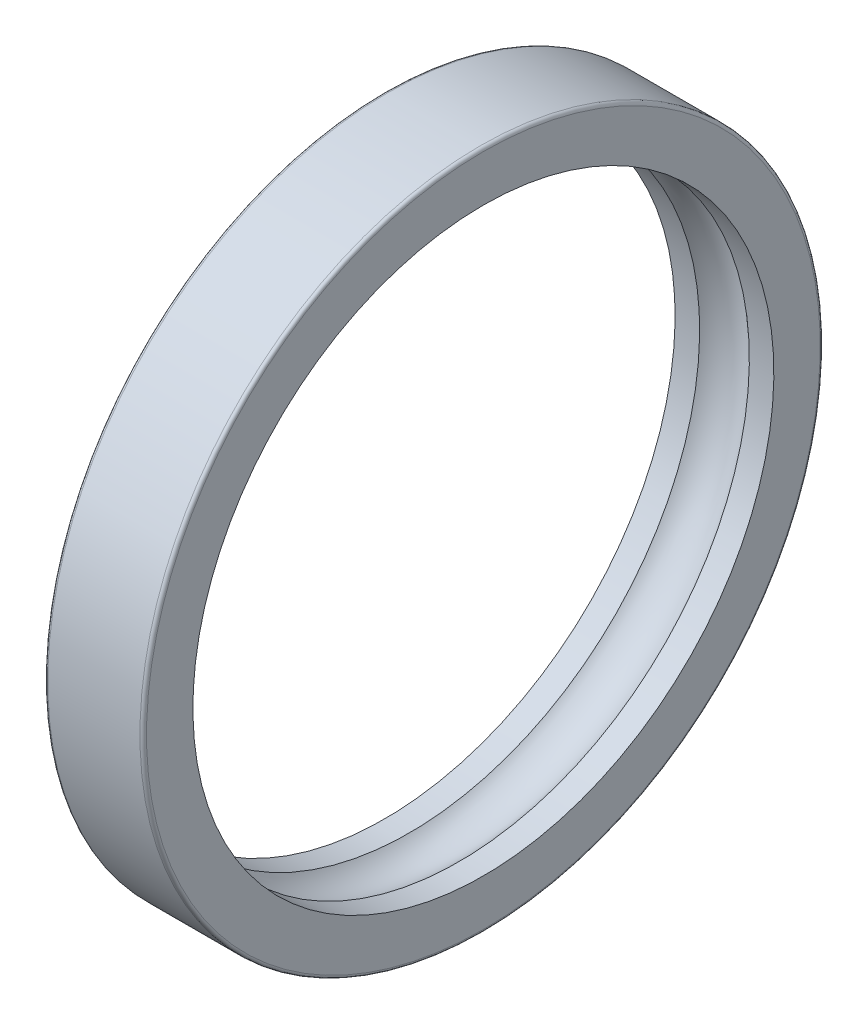
ISO-10303-21;
HEADER;
FILE_DESCRIPTION(('STEP AP214'),'2;1');
FILE_NAME('part.step','',(''),(''),'','','');
FILE_SCHEMA(('AUTOMOTIVE_DESIGN { 1 0 10303 214 1 1 1 1 }'));
ENDSEC;
DATA;
#1=APPLICATION_CONTEXT('core data for automotive mechanical design processes');
#2=APPLICATION_PROTOCOL_DEFINITION('international standard','automotive_design',2000,#1);
#3=PRODUCT_CONTEXT('',#1,'mechanical');
#4=PRODUCT('Part','Part','',(#3));
#5=PRODUCT_RELATED_PRODUCT_CATEGORY('part','',(#4));
#6=PRODUCT_DEFINITION_FORMATION('','',#4);
#7=PRODUCT_DEFINITION_CONTEXT('part definition',#1,'design');
#8=PRODUCT_DEFINITION('design','',#6,#7);
#9=PRODUCT_DEFINITION_SHAPE('','',#8);
#10=(LENGTH_UNIT() NAMED_UNIT(*) SI_UNIT(.MILLI.,.METRE.));
#11=(NAMED_UNIT(*) PLANE_ANGLE_UNIT() SI_UNIT($,.RADIAN.));
#12=(NAMED_UNIT(*) SI_UNIT($,.STERADIAN.) SOLID_ANGLE_UNIT());
#13=UNCERTAINTY_MEASURE_WITH_UNIT(LENGTH_MEASURE(1.E-05),#10,'distance_accuracy_value','');
#14=(GEOMETRIC_REPRESENTATION_CONTEXT(3) GLOBAL_UNCERTAINTY_ASSIGNED_CONTEXT((#13)) GLOBAL_UNIT_ASSIGNED_CONTEXT((#10,
#11,#12)) REPRESENTATION_CONTEXT('',''));
#15=CARTESIAN_POINT('',(0.,0.,0.));
#16=DIRECTION('',(0.,0.,1.));
#17=DIRECTION('',(1.,0.,0.));
#18=AXIS2_PLACEMENT_3D('',#15,#16,#17);
#19=CARTESIAN_POINT('',(7.88247516529059,0.,0.));
#20=DIRECTION('',(-1.,0.,0.));
#21=DIRECTION('',(0.,1.,0.));
#22=AXIS2_PLACEMENT_3D('',#19,#20,#21);
#23=CYLINDRICAL_SURFACE('',#22,26.475);
#24=CARTESIAN_POINT('',(9.,0.,0.));
#25=DIRECTION('',(1.,0.,0.));
#26=DIRECTION('',(0.,1.,0.));
#27=AXIS2_PLACEMENT_3D('',#24,#25,#26);
#28=CIRCLE('',#27,26.475);
#29=CARTESIAN_POINT('',(9.,26.475,0.));
#30=VERTEX_POINT('',#29);
#31=EDGE_CURVE('E10',#30,#30,#28,.T.);
#32=ORIENTED_EDGE('',*,*,#31,.T.);
#33=EDGE_LOOP('',(#32));
#34=FACE_BOUND('',#33,.T.);
#35=CARTESIAN_POINT('',(6.76495033058119,0.,0.));
#36=DIRECTION('',(1.,0.,0.));
#37=DIRECTION('',(0.,1.,0.));
#38=AXIS2_PLACEMENT_3D('',#35,#36,#37);
#39=CIRCLE('',#38,26.475);
#40=CARTESIAN_POINT('',(6.76495033058119,26.475,0.));
#41=VERTEX_POINT('',#40);
#42=EDGE_CURVE('E54',#41,#41,#39,.T.);
#43=ORIENTED_EDGE('',*,*,#42,.F.);
#44=EDGE_LOOP('',(#43));
#45=FACE_BOUND('',#44,.T.);
#46=ADVANCED_FACE('F15',(#34,#45),#23,.F.);
#47=CARTESIAN_POINT('',(9.,28.5875,0.));
#48=DIRECTION('',(1.,0.,0.));
#49=DIRECTION('',(0.,1.,0.));
#50=AXIS2_PLACEMENT_3D('',#47,#48,#49);
#51=PLANE('',#50);
#52=CARTESIAN_POINT('',(9.,0.,0.));
#53=DIRECTION('',(1.,0.,0.));
#54=DIRECTION('',(0.,1.,0.));
#55=AXIS2_PLACEMENT_3D('',#52,#53,#54);
#56=CIRCLE('',#55,30.7);
#57=CARTESIAN_POINT('',(9.,30.7,0.));
#58=VERTEX_POINT('',#57);
#59=EDGE_CURVE('E24',#58,#58,#56,.T.);
#60=ORIENTED_EDGE('',*,*,#59,.T.);
#61=EDGE_LOOP('',(#60));
#62=FACE_BOUND('',#61,.T.);
#63=ORIENTED_EDGE('',*,*,#31,.F.);
#64=EDGE_LOOP('',(#63));
#65=FACE_BOUND('',#64,.T.);
#66=ADVANCED_FACE('F83',(#62,#65),#51,.T.);
#67=CARTESIAN_POINT('',(8.7,0.,0.));
#68=DIRECTION('',(1.,0.,0.));
#69=DIRECTION('',(0.,0.,-1.));
#70=AXIS2_PLACEMENT_3D('',#67,#68,#69);
#71=TOROIDAL_SURFACE('',#70,30.7,0.3);
#72=CARTESIAN_POINT('',(8.7,0.,0.));
#73=DIRECTION('',(1.,0.,0.));
#74=DIRECTION('',(0.,1.,0.));
#75=AXIS2_PLACEMENT_3D('',#72,#73,#74);
#76=CIRCLE('',#75,31.);
#77=CARTESIAN_POINT('',(8.7,31.,0.));
#78=VERTEX_POINT('',#77);
#79=EDGE_CURVE('E61',#78,#78,#76,.T.);
#80=ORIENTED_EDGE('',*,*,#79,.T.);
#81=EDGE_LOOP('',(#80));
#82=FACE_BOUND('',#81,.T.);
#83=ORIENTED_EDGE('',*,*,#59,.F.);
#84=EDGE_LOOP('',(#83));
#85=FACE_BOUND('',#84,.T.);
#86=ADVANCED_FACE('F88',(#82,#85),#71,.T.);
#87=CARTESIAN_POINT('',(4.5,0.,0.));
#88=DIRECTION('',(-1.,0.,0.));
#89=DIRECTION('',(0.,1.,0.));
#90=AXIS2_PLACEMENT_3D('',#87,#88,#89);
#91=CYLINDRICAL_SURFACE('',#90,31.);
#92=CARTESIAN_POINT('',(0.3,0.,0.));
#93=DIRECTION('',(1.,0.,0.));
#94=DIRECTION('',(0.,1.,0.));
#95=AXIS2_PLACEMENT_3D('',#92,#93,#94);
#96=CIRCLE('',#95,31.);
#97=CARTESIAN_POINT('',(0.3,31.,0.));
#98=VERTEX_POINT('',#97);
#99=EDGE_CURVE('E56',#98,#98,#96,.T.);
#100=ORIENTED_EDGE('',*,*,#99,.T.);
#101=EDGE_LOOP('',(#100));
#102=FACE_BOUND('',#101,.T.);
#103=ORIENTED_EDGE('',*,*,#79,.F.);
#104=EDGE_LOOP('',(#103));
#105=FACE_BOUND('',#104,.T.);
#106=ADVANCED_FACE('F93',(#102,#105),#91,.T.);
#107=CARTESIAN_POINT('',(0.3,0.,0.));
#108=DIRECTION('',(1.,0.,0.));
#109=DIRECTION('',(0.,0.,-1.));
#110=AXIS2_PLACEMENT_3D('',#107,#108,#109);
#111=TOROIDAL_SURFACE('',#110,30.7,0.3);
#112=CARTESIAN_POINT('',(0.,0.,0.));
#113=DIRECTION('',(1.,0.,0.));
#114=DIRECTION('',(0.,1.,0.));
#115=AXIS2_PLACEMENT_3D('',#112,#113,#114);
#116=CIRCLE('',#115,30.7);
#117=CARTESIAN_POINT('',(0.,30.7,0.));
#118=VERTEX_POINT('',#117);
#119=EDGE_CURVE('E47',#118,#118,#116,.T.);
#120=ORIENTED_EDGE('',*,*,#119,.T.);
#121=EDGE_LOOP('',(#120));
#122=FACE_BOUND('',#121,.T.);
#123=ORIENTED_EDGE('',*,*,#99,.F.);
#124=EDGE_LOOP('',(#123));
#125=FACE_BOUND('',#124,.T.);
#126=ADVANCED_FACE('F95',(#122,#125),#111,.T.);
#127=CARTESIAN_POINT('',(0.,28.5875,0.));
#128=DIRECTION('',(-1.,0.,0.));
#129=DIRECTION('',(0.,-1.,0.));
#130=AXIS2_PLACEMENT_3D('',#127,#128,#129);
#131=PLANE('',#130);
#132=CARTESIAN_POINT('',(0.,0.,0.));
#133=DIRECTION('',(1.,0.,0.));
#134=DIRECTION('',(0.,1.,0.));
#135=AXIS2_PLACEMENT_3D('',#132,#133,#134);
#136=CIRCLE('',#135,26.475);
#137=CARTESIAN_POINT('',(0.,26.475,0.));
#138=VERTEX_POINT('',#137);
#139=EDGE_CURVE('E51',#138,#138,#136,.T.);
#140=ORIENTED_EDGE('',*,*,#139,.T.);
#141=EDGE_LOOP('',(#140));
#142=FACE_BOUND('',#141,.T.);
#143=ORIENTED_EDGE('',*,*,#119,.F.);
#144=EDGE_LOOP('',(#143));
#145=FACE_BOUND('',#144,.T.);
#146=ADVANCED_FACE('F17',(#142,#145),#131,.T.);
#147=CARTESIAN_POINT('',(1.1175248347094,0.,0.));
#148=DIRECTION('',(-1.,0.,0.));
#149=DIRECTION('',(0.,1.,0.));
#150=AXIS2_PLACEMENT_3D('',#147,#148,#149);
#151=CYLINDRICAL_SURFACE('',#150,26.475);
#152=CARTESIAN_POINT('',(2.2350496694188,0.,0.));
#153=DIRECTION('',(1.,0.,0.));
#154=DIRECTION('',(0.,1.,0.));
#155=AXIS2_PLACEMENT_3D('',#152,#153,#154);
#156=CIRCLE('',#155,26.475);
#157=CARTESIAN_POINT('',(2.2350496694188,26.475,0.));
#158=VERTEX_POINT('',#157);
#159=EDGE_CURVE('E58',#158,#158,#156,.T.);
#160=ORIENTED_EDGE('',*,*,#159,.T.);
#161=EDGE_LOOP('',(#160));
#162=FACE_BOUND('',#161,.T.);
#163=ORIENTED_EDGE('',*,*,#139,.F.);
#164=EDGE_LOOP('',(#163));
#165=FACE_BOUND('',#164,.T.);
#166=ADVANCED_FACE('F70',(#162,#165),#151,.F.);
#167=CARTESIAN_POINT('',(4.5,0.,0.));
#168=DIRECTION('',(1.,0.,0.));
#169=DIRECTION('',(0.,0.,-1.));
#170=AXIS2_PLACEMENT_3D('',#167,#168,#169);
#171=TOROIDAL_SURFACE('',#170,24.25,3.175);
#172=ORIENTED_EDGE('',*,*,#42,.T.);
#173=EDGE_LOOP('',(#172));
#174=FACE_BOUND('',#173,.T.);
#175=ORIENTED_EDGE('',*,*,#159,.F.);
#176=EDGE_LOOP('',(#175));
#177=FACE_BOUND('',#176,.T.);
#178=ADVANCED_FACE('F72',(#174,#177),#171,.F.);
#179=CLOSED_SHELL('',(#46,#66,#86,#106,#126,#146,#166,#178));
#180=MANIFOLD_SOLID_BREP('B1',#179);
#181=ADVANCED_BREP_SHAPE_REPRESENTATION('',(#18,#180),#14);
#182=SHAPE_DEFINITION_REPRESENTATION(#9,#181);
ENDSEC;
END-ISO-10303-21;
